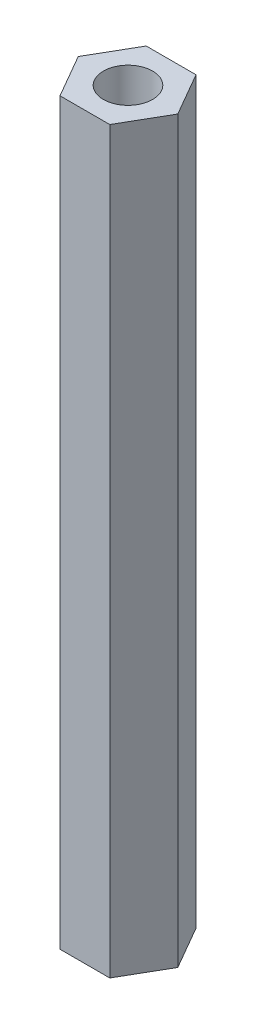
ISO-10303-21;
HEADER;
FILE_DESCRIPTION(('STEP AP214'),'2;1');
FILE_NAME('part.step','',(''),(''),'','','');
FILE_SCHEMA(('AUTOMOTIVE_DESIGN { 1 0 10303 214 1 1 1 1 }'));
ENDSEC;
DATA;
#1=APPLICATION_CONTEXT('core data for automotive mechanical design processes');
#2=APPLICATION_PROTOCOL_DEFINITION('international standard','automotive_design',2000,#1);
#3=PRODUCT_CONTEXT('',#1,'mechanical');
#4=PRODUCT('Part','Part','',(#3));
#5=PRODUCT_RELATED_PRODUCT_CATEGORY('part','',(#4));
#6=PRODUCT_DEFINITION_FORMATION('','',#4);
#7=PRODUCT_DEFINITION_CONTEXT('part definition',#1,'design');
#8=PRODUCT_DEFINITION('design','',#6,#7);
#9=PRODUCT_DEFINITION_SHAPE('','',#8);
#10=(LENGTH_UNIT() NAMED_UNIT(*) SI_UNIT(.MILLI.,.METRE.));
#11=(NAMED_UNIT(*) PLANE_ANGLE_UNIT() SI_UNIT($,.RADIAN.));
#12=(NAMED_UNIT(*) SI_UNIT($,.STERADIAN.) SOLID_ANGLE_UNIT());
#13=UNCERTAINTY_MEASURE_WITH_UNIT(LENGTH_MEASURE(1.E-05),#10,'distance_accuracy_value','');
#14=(GEOMETRIC_REPRESENTATION_CONTEXT(3) GLOBAL_UNCERTAINTY_ASSIGNED_CONTEXT((#13)) GLOBAL_UNIT_ASSIGNED_CONTEXT((#10,
#11,#12)) REPRESENTATION_CONTEXT('',''));
#15=CARTESIAN_POINT('',(0.,0.,0.));
#16=DIRECTION('',(0.,0.,1.));
#17=DIRECTION('',(1.,0.,0.));
#18=AXIS2_PLACEMENT_3D('',#15,#16,#17);
#19=CARTESIAN_POINT('',(0.,60.,0.));
#20=DIRECTION('',(0.,1.,0.));
#21=DIRECTION('',(0.,0.,1.));
#22=AXIS2_PLACEMENT_3D('',#19,#20,#21);
#23=PLANE('',#22);
#24=DIRECTION('',(0.5,0.,-0.866025403784439));
#25=VECTOR('',#24,1.);
#26=CARTESIAN_POINT('',(2.02072594216369,60.,3.5));
#27=LINE('',#26,#25);
#28=CARTESIAN_POINT('',(2.02072594216369,60.,3.5));
#29=VERTEX_POINT('',#28);
#30=CARTESIAN_POINT('',(4.04145188432738,60.,0.));
#31=VERTEX_POINT('',#30);
#32=EDGE_CURVE('E130',#29,#31,#27,.T.);
#33=ORIENTED_EDGE('',*,*,#32,.T.);
#34=DIRECTION('',(-0.5,0.,-0.866025403784438));
#35=VECTOR('',#34,1.);
#36=CARTESIAN_POINT('',(4.04145188432738,60.,0.));
#37=LINE('',#36,#35);
#38=CARTESIAN_POINT('',(2.02072594216369,60.,-3.5));
#39=VERTEX_POINT('',#38);
#40=EDGE_CURVE('E88',#31,#39,#37,.T.);
#41=ORIENTED_EDGE('',*,*,#40,.T.);
#42=DIRECTION('',(-1.,0.,0.));
#43=VECTOR('',#42,1.);
#44=CARTESIAN_POINT('',(2.02072594216369,60.,-3.5));
#45=LINE('',#44,#43);
#46=CARTESIAN_POINT('',(-2.02072594216369,60.,-3.5));
#47=VERTEX_POINT('',#46);
#48=EDGE_CURVE('E101',#39,#47,#45,.T.);
#49=ORIENTED_EDGE('',*,*,#48,.T.);
#50=DIRECTION('',(-0.5,0.,0.866025403784439));
#51=VECTOR('',#50,1.);
#52=CARTESIAN_POINT('',(-2.02072594216369,60.,-3.5));
#53=LINE('',#52,#51);
#54=CARTESIAN_POINT('',(-4.04145188432738,60.,0.));
#55=VERTEX_POINT('',#54);
#56=EDGE_CURVE('E95',#47,#55,#53,.T.);
#57=ORIENTED_EDGE('',*,*,#56,.T.);
#58=DIRECTION('',(0.5,0.,0.866025403784439));
#59=VECTOR('',#58,1.);
#60=CARTESIAN_POINT('',(-4.04145188432738,60.,0.));
#61=LINE('',#60,#59);
#62=CARTESIAN_POINT('',(-2.02072594216369,60.,3.5));
#63=VERTEX_POINT('',#62);
#64=EDGE_CURVE('E99',#55,#63,#61,.T.);
#65=ORIENTED_EDGE('',*,*,#64,.T.);
#66=DIRECTION('',(1.,0.,0.));
#67=VECTOR('',#66,1.);
#68=CARTESIAN_POINT('',(-2.02072594216369,60.,3.5));
#69=LINE('',#68,#67);
#70=EDGE_CURVE('E51',#63,#29,#69,.T.);
#71=ORIENTED_EDGE('',*,*,#70,.T.);
#72=EDGE_LOOP('',(#33,#41,#49,#57,#65,#71));
#73=FACE_BOUND('',#72,.T.);
#74=CARTESIAN_POINT('',(0.,60.,0.));
#75=DIRECTION('',(0.,1.,0.));
#76=DIRECTION('',(0.,0.,1.));
#77=AXIS2_PLACEMENT_3D('',#74,#75,#76);
#78=CIRCLE('',#77,2.);
#79=CARTESIAN_POINT('',(0.,60.,2.));
#80=VERTEX_POINT('',#79);
#81=EDGE_CURVE('E123',#80,#80,#78,.T.);
#82=ORIENTED_EDGE('',*,*,#81,.F.);
#83=EDGE_LOOP('',(#82));
#84=FACE_BOUND('',#83,.T.);
#85=ADVANCED_FACE('F34',(#73,#84),#23,.T.);
#86=CARTESIAN_POINT('',(0.,0.,0.));
#87=DIRECTION('',(0.,1.,0.));
#88=DIRECTION('',(0.,0.,1.));
#89=AXIS2_PLACEMENT_3D('',#86,#87,#88);
#90=PLANE('',#89);
#91=DIRECTION('',(0.5,0.,-0.866025403784439));
#92=VECTOR('',#91,1.);
#93=CARTESIAN_POINT('',(2.02072594216369,0.,3.5));
#94=LINE('',#93,#92);
#95=CARTESIAN_POINT('',(2.02072594216369,0.,3.5));
#96=VERTEX_POINT('',#95);
#97=CARTESIAN_POINT('',(4.04145188432738,0.,0.));
#98=VERTEX_POINT('',#97);
#99=EDGE_CURVE('E119',#96,#98,#94,.T.);
#100=ORIENTED_EDGE('',*,*,#99,.F.);
#101=DIRECTION('',(1.,0.,0.));
#102=VECTOR('',#101,1.);
#103=CARTESIAN_POINT('',(-2.02072594216369,0.,3.5));
#104=LINE('',#103,#102);
#105=CARTESIAN_POINT('',(-2.02072594216369,0.,3.5));
#106=VERTEX_POINT('',#105);
#107=EDGE_CURVE('E80',#106,#96,#104,.T.);
#108=ORIENTED_EDGE('',*,*,#107,.F.);
#109=DIRECTION('',(0.5,0.,0.866025403784439));
#110=VECTOR('',#109,1.);
#111=CARTESIAN_POINT('',(-4.04145188432738,0.,0.));
#112=LINE('',#111,#110);
#113=CARTESIAN_POINT('',(-4.04145188432738,0.,0.));
#114=VERTEX_POINT('',#113);
#115=EDGE_CURVE('E74',#114,#106,#112,.T.);
#116=ORIENTED_EDGE('',*,*,#115,.F.);
#117=DIRECTION('',(-0.5,0.,0.866025403784439));
#118=VECTOR('',#117,1.);
#119=CARTESIAN_POINT('',(-2.02072594216369,0.,-3.5));
#120=LINE('',#119,#118);
#121=CARTESIAN_POINT('',(-2.02072594216369,0.,-3.5));
#122=VERTEX_POINT('',#121);
#123=EDGE_CURVE('E109',#122,#114,#120,.T.);
#124=ORIENTED_EDGE('',*,*,#123,.F.);
#125=DIRECTION('',(-1.,0.,0.));
#126=VECTOR('',#125,1.);
#127=CARTESIAN_POINT('',(2.02072594216369,0.,-3.5));
#128=LINE('',#127,#126);
#129=CARTESIAN_POINT('',(2.02072594216369,0.,-3.5));
#130=VERTEX_POINT('',#129);
#131=EDGE_CURVE('E125',#130,#122,#128,.T.);
#132=ORIENTED_EDGE('',*,*,#131,.F.);
#133=DIRECTION('',(-0.5,0.,-0.866025403784438));
#134=VECTOR('',#133,1.);
#135=CARTESIAN_POINT('',(4.04145188432738,0.,0.));
#136=LINE('',#135,#134);
#137=EDGE_CURVE('E122',#98,#130,#136,.T.);
#138=ORIENTED_EDGE('',*,*,#137,.F.);
#139=EDGE_LOOP('',(#100,#108,#116,#124,#132,#138));
#140=FACE_BOUND('',#139,.T.);
#141=CARTESIAN_POINT('',(0.,0.,0.));
#142=DIRECTION('',(0.,1.,0.));
#143=DIRECTION('',(0.,0.,1.));
#144=AXIS2_PLACEMENT_3D('',#141,#142,#143);
#145=CIRCLE('',#144,2.);
#146=CARTESIAN_POINT('',(0.,0.,2.));
#147=VERTEX_POINT('',#146);
#148=EDGE_CURVE('E223',#147,#147,#145,.T.);
#149=ORIENTED_EDGE('',*,*,#148,.T.);
#150=EDGE_LOOP('',(#149));
#151=FACE_BOUND('',#150,.T.);
#152=ADVANCED_FACE('F139',(#140,#151),#90,.F.);
#153=CARTESIAN_POINT('',(2.02072594216369,60.,3.5));
#154=DIRECTION('',(-0.866025403784439,0.,-0.5));
#155=DIRECTION('',(-0.5,0.,0.866025403784439));
#156=AXIS2_PLACEMENT_3D('',#153,#154,#155);
#157=PLANE('',#156);
#158=ORIENTED_EDGE('',*,*,#99,.T.);
#159=DIRECTION('',(0.,-1.,0.));
#160=VECTOR('',#159,1.);
#161=CARTESIAN_POINT('',(4.04145188432738,60.,0.));
#162=LINE('',#161,#160);
#163=EDGE_CURVE('E11',#31,#98,#162,.T.);
#164=ORIENTED_EDGE('',*,*,#163,.F.);
#165=ORIENTED_EDGE('',*,*,#32,.F.);
#166=DIRECTION('',(0.,-1.,0.));
#167=VECTOR('',#166,1.);
#168=CARTESIAN_POINT('',(2.02072594216369,60.,3.5));
#169=LINE('',#168,#167);
#170=EDGE_CURVE('E115',#29,#96,#169,.T.);
#171=ORIENTED_EDGE('',*,*,#170,.T.);
#172=EDGE_LOOP('',(#158,#164,#165,#171));
#173=FACE_BOUND('',#172,.T.);
#174=ADVANCED_FACE('F36',(#173),#157,.F.);
#175=CARTESIAN_POINT('',(4.04145188432738,60.,0.));
#176=DIRECTION('',(-0.866025403784438,0.,0.5));
#177=DIRECTION('',(0.5,0.,0.866025403784438));
#178=AXIS2_PLACEMENT_3D('',#175,#176,#177);
#179=PLANE('',#178);
#180=ORIENTED_EDGE('',*,*,#137,.T.);
#181=DIRECTION('',(0.,-1.,0.));
#182=VECTOR('',#181,1.);
#183=CARTESIAN_POINT('',(2.02072594216369,60.,-3.5));
#184=LINE('',#183,#182);
#185=EDGE_CURVE('E43',#39,#130,#184,.T.);
#186=ORIENTED_EDGE('',*,*,#185,.F.);
#187=ORIENTED_EDGE('',*,*,#40,.F.);
#188=ORIENTED_EDGE('',*,*,#163,.T.);
#189=EDGE_LOOP('',(#180,#186,#187,#188));
#190=FACE_BOUND('',#189,.T.);
#191=ADVANCED_FACE('F164',(#190),#179,.F.);
#192=CARTESIAN_POINT('',(2.02072594216369,60.,-3.5));
#193=DIRECTION('',(0.,0.,1.));
#194=DIRECTION('',(1.,0.,0.));
#195=AXIS2_PLACEMENT_3D('',#192,#193,#194);
#196=PLANE('',#195);
#197=ORIENTED_EDGE('',*,*,#131,.T.);
#198=DIRECTION('',(0.,-1.,0.));
#199=VECTOR('',#198,1.);
#200=CARTESIAN_POINT('',(-2.02072594216369,60.,-3.5));
#201=LINE('',#200,#199);
#202=EDGE_CURVE('E110',#47,#122,#201,.T.);
#203=ORIENTED_EDGE('',*,*,#202,.F.);
#204=ORIENTED_EDGE('',*,*,#48,.F.);
#205=ORIENTED_EDGE('',*,*,#185,.T.);
#206=EDGE_LOOP('',(#197,#203,#204,#205));
#207=FACE_BOUND('',#206,.T.);
#208=ADVANCED_FACE('F136',(#207),#196,.F.);
#209=CARTESIAN_POINT('',(-2.02072594216369,60.,-3.5));
#210=DIRECTION('',(0.866025403784439,0.,0.5));
#211=DIRECTION('',(0.5,0.,-0.866025403784439));
#212=AXIS2_PLACEMENT_3D('',#209,#210,#211);
#213=PLANE('',#212);
#214=ORIENTED_EDGE('',*,*,#123,.T.);
#215=DIRECTION('',(0.,-1.,0.));
#216=VECTOR('',#215,1.);
#217=CARTESIAN_POINT('',(-4.04145188432738,60.,0.));
#218=LINE('',#217,#216);
#219=EDGE_CURVE('E106',#55,#114,#218,.T.);
#220=ORIENTED_EDGE('',*,*,#219,.F.);
#221=ORIENTED_EDGE('',*,*,#56,.F.);
#222=ORIENTED_EDGE('',*,*,#202,.T.);
#223=EDGE_LOOP('',(#214,#220,#221,#222));
#224=FACE_BOUND('',#223,.T.);
#225=ADVANCED_FACE('F107',(#224),#213,.F.);
#226=CARTESIAN_POINT('',(-4.04145188432738,60.,0.));
#227=DIRECTION('',(0.866025403784439,0.,-0.5));
#228=DIRECTION('',(-0.5,0.,-0.866025403784439));
#229=AXIS2_PLACEMENT_3D('',#226,#227,#228);
#230=PLANE('',#229);
#231=ORIENTED_EDGE('',*,*,#115,.T.);
#232=DIRECTION('',(0.,-1.,0.));
#233=VECTOR('',#232,1.);
#234=CARTESIAN_POINT('',(-2.02072594216369,60.,3.5));
#235=LINE('',#234,#233);
#236=EDGE_CURVE('E111',#63,#106,#235,.T.);
#237=ORIENTED_EDGE('',*,*,#236,.F.);
#238=ORIENTED_EDGE('',*,*,#64,.F.);
#239=ORIENTED_EDGE('',*,*,#219,.T.);
#240=EDGE_LOOP('',(#231,#237,#238,#239));
#241=FACE_BOUND('',#240,.T.);
#242=ADVANCED_FACE('F113',(#241),#230,.F.);
#243=CARTESIAN_POINT('',(-2.02072594216369,60.,3.5));
#244=DIRECTION('',(0.,0.,-1.));
#245=DIRECTION('',(-1.,0.,0.));
#246=AXIS2_PLACEMENT_3D('',#243,#244,#245);
#247=PLANE('',#246);
#248=ORIENTED_EDGE('',*,*,#107,.T.);
#249=ORIENTED_EDGE('',*,*,#170,.F.);
#250=ORIENTED_EDGE('',*,*,#70,.F.);
#251=ORIENTED_EDGE('',*,*,#236,.T.);
#252=EDGE_LOOP('',(#248,#249,#250,#251));
#253=FACE_BOUND('',#252,.T.);
#254=ADVANCED_FACE('F144',(#253),#247,.F.);
#255=CARTESIAN_POINT('',(0.,60.,0.));
#256=DIRECTION('',(0.,-1.,0.));
#257=DIRECTION('',(0.,0.,-1.));
#258=AXIS2_PLACEMENT_3D('',#255,#256,#257);
#259=CYLINDRICAL_SURFACE('',#258,2.);
#260=ORIENTED_EDGE('',*,*,#81,.T.);
#261=EDGE_LOOP('',(#260));
#262=FACE_BOUND('',#261,.T.);
#263=ORIENTED_EDGE('',*,*,#148,.F.);
#264=EDGE_LOOP('',(#263));
#265=FACE_BOUND('',#264,.T.);
#266=ADVANCED_FACE('F146',(#262,#265),#259,.F.);
#267=CLOSED_SHELL('',(#85,#152,#174,#191,#208,#225,#242,#254,#266));
#268=MANIFOLD_SOLID_BREP('B2',#267);
#269=ADVANCED_BREP_SHAPE_REPRESENTATION('',(#18,#268),#14);
#270=SHAPE_DEFINITION_REPRESENTATION(#9,#269);
ENDSEC;
END-ISO-10303-21;
